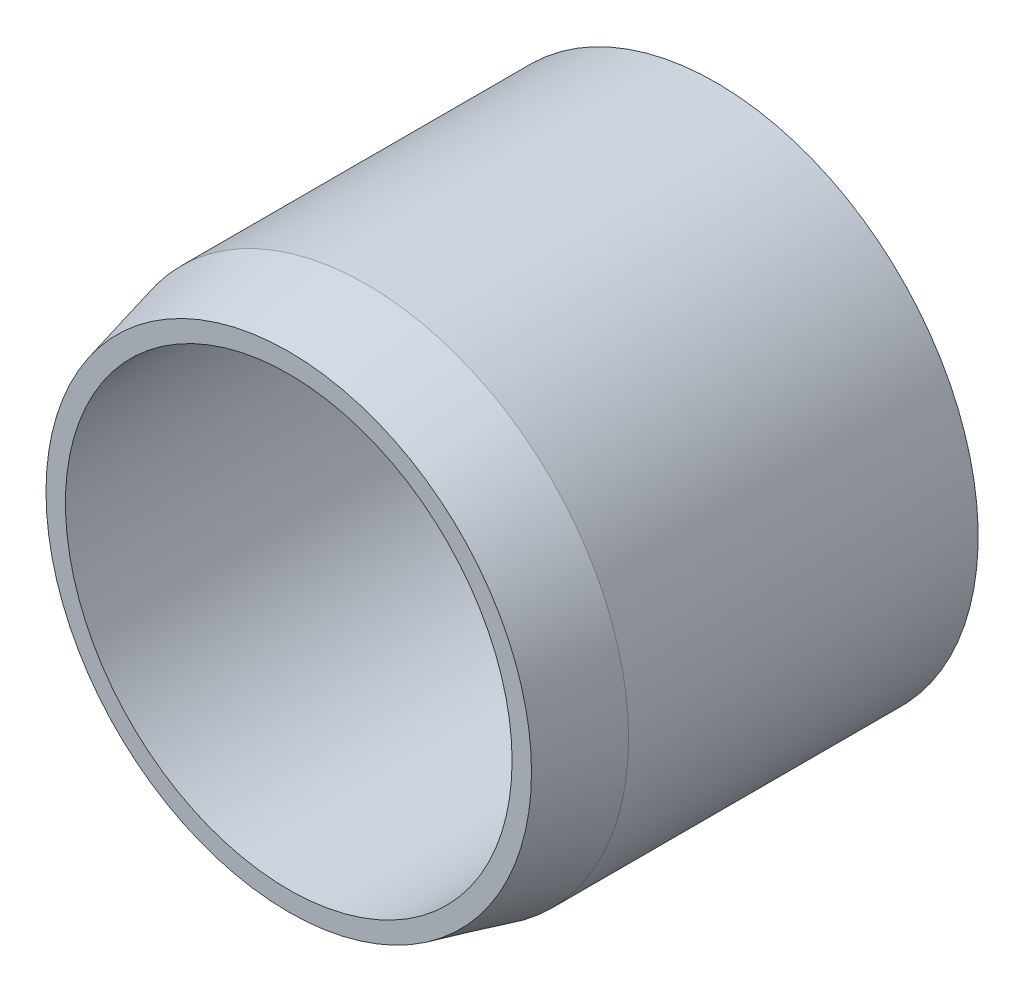
ISO-10303-21;
HEADER;
FILE_DESCRIPTION(('STEP AP214'),'2;1');
FILE_NAME('part.step','',(''),(''),'','','');
FILE_SCHEMA(('AUTOMOTIVE_DESIGN { 1 0 10303 214 1 1 1 1 }'));
ENDSEC;
DATA;
#1=APPLICATION_CONTEXT('core data for automotive mechanical design processes');
#2=APPLICATION_PROTOCOL_DEFINITION('international standard','automotive_design',2000,#1);
#3=PRODUCT_CONTEXT('',#1,'mechanical');
#4=PRODUCT('Part','Part','',(#3));
#5=PRODUCT_RELATED_PRODUCT_CATEGORY('part','',(#4));
#6=PRODUCT_DEFINITION_FORMATION('','',#4);
#7=PRODUCT_DEFINITION_CONTEXT('part definition',#1,'design');
#8=PRODUCT_DEFINITION('design','',#6,#7);
#9=PRODUCT_DEFINITION_SHAPE('','',#8);
#10=(LENGTH_UNIT() NAMED_UNIT(*) SI_UNIT(.MILLI.,.METRE.));
#11=(NAMED_UNIT(*) PLANE_ANGLE_UNIT() SI_UNIT($,.RADIAN.));
#12=(NAMED_UNIT(*) SI_UNIT($,.STERADIAN.) SOLID_ANGLE_UNIT());
#13=UNCERTAINTY_MEASURE_WITH_UNIT(LENGTH_MEASURE(1.E-05),#10,'distance_accuracy_value','');
#14=(GEOMETRIC_REPRESENTATION_CONTEXT(3) GLOBAL_UNCERTAINTY_ASSIGNED_CONTEXT((#13)) GLOBAL_UNIT_ASSIGNED_CONTEXT((#10,
#11,#12)) REPRESENTATION_CONTEXT('',''));
#15=CARTESIAN_POINT('',(0.,0.,0.));
#16=DIRECTION('',(0.,0.,1.));
#17=DIRECTION('',(1.,0.,0.));
#18=AXIS2_PLACEMENT_3D('',#15,#16,#17);
#19=CARTESIAN_POINT('',(0.,0.,16.));
#20=DIRECTION('',(0.,0.,-1.));
#21=DIRECTION('',(-1.,0.,0.));
#22=AXIS2_PLACEMENT_3D('',#19,#20,#21);
#23=CYLINDRICAL_SURFACE('',#22,13.5);
#24=CARTESIAN_POINT('',(0.,0.,16.));
#25=DIRECTION('',(0.,0.,1.));
#26=DIRECTION('',(1.,0.,0.));
#27=AXIS2_PLACEMENT_3D('',#24,#25,#26);
#28=CIRCLE('',#27,13.5);
#29=CARTESIAN_POINT('',(13.5,0.,16.));
#30=VERTEX_POINT('',#29);
#31=EDGE_CURVE('E11',#30,#30,#28,.T.);
#32=ORIENTED_EDGE('',*,*,#31,.F.);
#33=EDGE_LOOP('',(#32));
#34=FACE_BOUND('',#33,.T.);
#35=CARTESIAN_POINT('',(0.,0.,-2.));
#36=DIRECTION('',(0.,0.,-1.));
#37=DIRECTION('',(-1.,0.,0.));
#38=AXIS2_PLACEMENT_3D('',#35,#36,#37);
#39=CIRCLE('',#38,13.5);
#40=CARTESIAN_POINT('',(-13.5,0.,-2.));
#41=VERTEX_POINT('',#40);
#42=EDGE_CURVE('E58',#41,#41,#39,.T.);
#43=ORIENTED_EDGE('',*,*,#42,.F.);
#44=EDGE_LOOP('',(#43));
#45=FACE_BOUND('',#44,.T.);
#46=ADVANCED_FACE('F47',(#34,#45),#23,.T.);
#47=CARTESIAN_POINT('',(0.,0.,-2.));
#48=DIRECTION('',(0.,0.,-1.));
#49=DIRECTION('',(-1.,0.,0.));
#50=AXIS2_PLACEMENT_3D('',#47,#48,#49);
#51=PLANE('',#50);
#52=ORIENTED_EDGE('',*,*,#42,.T.);
#53=EDGE_LOOP('',(#52));
#54=FACE_BOUND('',#53,.T.);
#55=ADVANCED_FACE('F76',(#54),#51,.T.);
#56=CARTESIAN_POINT('',(0.,0.,20.));
#57=DIRECTION('',(0.,0.,1.));
#58=DIRECTION('',(1.,0.,0.));
#59=AXIS2_PLACEMENT_3D('',#56,#57,#58);
#60=PLANE('',#59);
#61=CARTESIAN_POINT('',(0.,0.,20.));
#62=DIRECTION('',(0.,0.,1.));
#63=DIRECTION('',(1.,0.,0.));
#64=AXIS2_PLACEMENT_3D('',#61,#62,#63);
#65=CIRCLE('',#64,12.5);
#66=CARTESIAN_POINT('',(12.5,0.,20.));
#67=VERTEX_POINT('',#66);
#68=EDGE_CURVE('E62',#67,#67,#65,.T.);
#69=ORIENTED_EDGE('',*,*,#68,.T.);
#70=EDGE_LOOP('',(#69));
#71=FACE_BOUND('',#70,.T.);
#72=CARTESIAN_POINT('',(0.,0.,20.));
#73=DIRECTION('',(0.,0.,1.));
#74=DIRECTION('',(1.,0.,0.));
#75=AXIS2_PLACEMENT_3D('',#72,#73,#74);
#76=CIRCLE('',#75,11.5);
#77=CARTESIAN_POINT('',(11.5,0.,20.));
#78=VERTEX_POINT('',#77);
#79=EDGE_CURVE('E67',#78,#78,#76,.T.);
#80=ORIENTED_EDGE('',*,*,#79,.F.);
#81=EDGE_LOOP('',(#80));
#82=FACE_BOUND('',#81,.T.);
#83=ADVANCED_FACE('F73',(#71,#82),#60,.T.);
#84=CARTESIAN_POINT('',(0.,0.,0.));
#85=DIRECTION('',(0.,0.,-1.));
#86=DIRECTION('',(-1.,0.,0.));
#87=AXIS2_PLACEMENT_3D('',#84,#85,#86);
#88=PLANE('',#87);
#89=CARTESIAN_POINT('',(0.,0.,0.));
#90=DIRECTION('',(0.,0.,1.));
#91=DIRECTION('',(1.,0.,0.));
#92=AXIS2_PLACEMENT_3D('',#89,#90,#91);
#93=CIRCLE('',#92,11.5);
#94=CARTESIAN_POINT('',(11.5,0.,0.));
#95=VERTEX_POINT('',#94);
#96=EDGE_CURVE('E54',#95,#95,#93,.T.);
#97=ORIENTED_EDGE('',*,*,#96,.T.);
#98=EDGE_LOOP('',(#97));
#99=FACE_BOUND('',#98,.T.);
#100=ADVANCED_FACE('F75',(#99),#88,.F.);
#101=CARTESIAN_POINT('',(0.,0.,16.));
#102=DIRECTION('',(0.,0.,-1.));
#103=DIRECTION('',(-1.,0.,0.));
#104=AXIS2_PLACEMENT_3D('',#101,#102,#103);
#105=CYLINDRICAL_SURFACE('',#104,11.5);
#106=ORIENTED_EDGE('',*,*,#96,.F.);
#107=EDGE_LOOP('',(#106));
#108=FACE_BOUND('',#107,.T.);
#109=ORIENTED_EDGE('',*,*,#79,.T.);
#110=EDGE_LOOP('',(#109));
#111=FACE_BOUND('',#110,.T.);
#112=ADVANCED_FACE('F71',(#108,#111),#105,.F.);
#113=CARTESIAN_POINT('',(0.,0.,20.));
#114=DIRECTION('',(0.,0.,-1.));
#115=DIRECTION('',(-1.,0.,0.));
#116=AXIS2_PLACEMENT_3D('',#113,#114,#115);
#117=CONICAL_SURFACE('',#116,12.5,0.244978663126868);
#118=ORIENTED_EDGE('',*,*,#31,.T.);
#119=EDGE_LOOP('',(#118));
#120=FACE_BOUND('',#119,.T.);
#121=ORIENTED_EDGE('',*,*,#68,.F.);
#122=EDGE_LOOP('',(#121));
#123=FACE_BOUND('',#122,.T.);
#124=ADVANCED_FACE('F49',(#120,#123),#117,.T.);
#125=CLOSED_SHELL('',(#46,#55,#83,#100,#112,#124));
#126=MANIFOLD_SOLID_BREP('B2',#125);
#127=ADVANCED_BREP_SHAPE_REPRESENTATION('',(#18,#126),#14);
#128=SHAPE_DEFINITION_REPRESENTATION(#9,#127);
ENDSEC;
END-ISO-10303-21;
